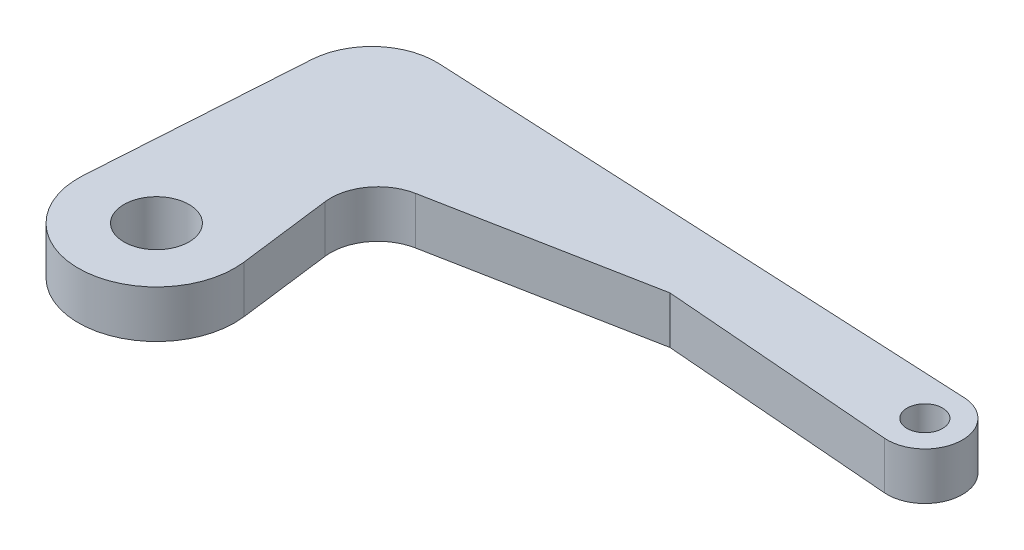
ISO-10303-21;
HEADER;
FILE_DESCRIPTION(('STEP AP214'),'2;1');
FILE_NAME('part.step','',(''),(''),'','','');
FILE_SCHEMA(('AUTOMOTIVE_DESIGN { 1 0 10303 214 1 1 1 1 }'));
ENDSEC;
DATA;
#1=APPLICATION_CONTEXT('core data for automotive mechanical design processes');
#2=APPLICATION_PROTOCOL_DEFINITION('international standard','automotive_design',2000,#1);
#3=PRODUCT_CONTEXT('',#1,'mechanical');
#4=PRODUCT('Part','Part','',(#3));
#5=PRODUCT_RELATED_PRODUCT_CATEGORY('part','',(#4));
#6=PRODUCT_DEFINITION_FORMATION('','',#4);
#7=PRODUCT_DEFINITION_CONTEXT('part definition',#1,'design');
#8=PRODUCT_DEFINITION('design','',#6,#7);
#9=PRODUCT_DEFINITION_SHAPE('','',#8);
#10=(LENGTH_UNIT() NAMED_UNIT(*) SI_UNIT(.MILLI.,.METRE.));
#11=(NAMED_UNIT(*) PLANE_ANGLE_UNIT() SI_UNIT($,.RADIAN.));
#12=(NAMED_UNIT(*) SI_UNIT($,.STERADIAN.) SOLID_ANGLE_UNIT());
#13=UNCERTAINTY_MEASURE_WITH_UNIT(LENGTH_MEASURE(1.E-05),#10,'distance_accuracy_value','');
#14=(GEOMETRIC_REPRESENTATION_CONTEXT(3) GLOBAL_UNCERTAINTY_ASSIGNED_CONTEXT((#13)) GLOBAL_UNIT_ASSIGNED_CONTEXT((#10,
#11,#12)) REPRESENTATION_CONTEXT('',''));
#15=CARTESIAN_POINT('',(0.,0.,0.));
#16=DIRECTION('',(0.,0.,1.));
#17=DIRECTION('',(1.,0.,0.));
#18=AXIS2_PLACEMENT_3D('',#15,#16,#17);
#19=CARTESIAN_POINT('',(9.52234420175606,4.,-9.20862610009547));
#20=DIRECTION('',(0.,-1.,0.));
#21=DIRECTION('',(0.,0.,-1.));
#22=AXIS2_PLACEMENT_3D('',#19,#20,#21);
#23=PLANE('',#22);
#24=CARTESIAN_POINT('',(9.52234420175606,4.,-9.20862610009547));
#25=DIRECTION('',(0.,-1.,0.));
#26=DIRECTION('',(0.,0.,-1.));
#27=AXIS2_PLACEMENT_3D('',#24,#25,#26);
#28=CIRCLE('',#27,4.);
#29=CARTESIAN_POINT('',(5.55416512734207,4.,-8.70508381449976));
#30=VERTEX_POINT('',#29);
#31=CARTESIAN_POINT('',(8.76679218391496,4.,-13.1366206454502));
#32=VERTEX_POINT('',#31);
#33=EDGE_CURVE('E155',#30,#32,#28,.T.);
#34=ORIENTED_EDGE('',*,*,#33,.T.);
#35=DIRECTION('',(0.981998636338674,0.,-0.188888004460274));
#36=VECTOR('',#35,1.);
#37=CARTESIAN_POINT('',(26.8096543901335,4.,-16.6071756042545));
#38=LINE('',#37,#36);
#39=CARTESIAN_POINT('',(26.8096543901335,4.,-16.6071756042545));
#40=VERTEX_POINT('',#39);
#41=EDGE_CURVE('E98',#32,#40,#38,.T.);
#42=ORIENTED_EDGE('',*,*,#41,.T.);
#43=DIRECTION('',(0.99683244169773,0.,0.0795303915427397));
#44=VECTOR('',#43,1.);
#45=CARTESIAN_POINT('',(46.5214753194434,4.,-15.0345052426656));
#46=LINE('',#45,#44);
#47=CARTESIAN_POINT('',(46.5214753194434,4.,-15.0345052426656));
#48=VERTEX_POINT('',#47);
#49=EDGE_CURVE('E173',#40,#48,#46,.T.);
#50=ORIENTED_EDGE('',*,*,#49,.T.);
#51=CARTESIAN_POINT('',(46.7742611361364,4.,-18.2029179461947));
#52=DIRECTION('',(0.,1.,0.));
#53=DIRECTION('',(0.,0.,1.));
#54=AXIS2_PLACEMENT_3D('',#51,#52,#53);
#55=CIRCLE('',#54,3.17848072654309);
#56=CARTESIAN_POINT('',(46.927651624735,4.,-21.377695274924));
#57=VERTEX_POINT('',#56);
#58=EDGE_CURVE('E190',#48,#57,#55,.T.);
#59=ORIENTED_EDGE('',*,*,#58,.T.);
#60=DIRECTION('',(-0.998834852833025,0.,-0.0482590589012009));
#61=VECTOR('',#60,1.);
#62=CARTESIAN_POINT('',(46.927651624735,4.,-21.377695274924));
#63=LINE('',#62,#61);
#64=CARTESIAN_POINT('',(0.262324785062392,4.,-23.6323470326315));
#65=VERTEX_POINT('',#64);
#66=EDGE_CURVE('E189',#57,#65,#63,.T.);
#67=ORIENTED_EDGE('',*,*,#66,.T.);
#68=CARTESIAN_POINT('',(0.,4.,-18.2029179461947));
#69=DIRECTION('',(0.,1.,0.));
#70=DIRECTION('',(0.,0.,1.));
#71=AXIS2_PLACEMENT_3D('',#68,#69,#70);
#72=CIRCLE('',#71,5.43576254977205);
#73=CARTESIAN_POINT('',(-5.42452126957882,4.,-18.552322430126));
#74=VERTEX_POINT('',#73);
#75=EDGE_CURVE('E120',#65,#74,#72,.T.);
#76=ORIENTED_EDGE('',*,*,#75,.T.);
#77=DIRECTION('',(-0.0642788349807451,0.,0.997931977327873));
#78=VECTOR('',#77,1.);
#79=CARTESIAN_POINT('',(-5.42452126957882,4.,-18.552322430126));
#80=LINE('',#79,#78);
#81=CARTESIAN_POINT('',(-6.59216391292445,4.,-0.424614729211823));
#82=VERTEX_POINT('',#81);
#83=EDGE_CURVE('E114',#74,#82,#80,.T.);
#84=ORIENTED_EDGE('',*,*,#83,.T.);
#85=CARTESIAN_POINT('',(0.,4.,0.));
#86=DIRECTION('',(0.,1.,0.));
#87=DIRECTION('',(0.,0.,1.));
#88=AXIS2_PLACEMENT_3D('',#85,#86,#87);
#89=CIRCLE('',#88,6.60582490860354);
#90=CARTESIAN_POINT('',(6.55327404289082,4.,-0.831578043180825));
#91=VERTEX_POINT('',#90);
#92=EDGE_CURVE('E118',#82,#91,#89,.T.);
#93=ORIENTED_EDGE('',*,*,#92,.T.);
#94=DIRECTION('',(-0.125885571398928,0.,-0.992044768603497));
#95=VECTOR('',#94,1.);
#96=CARTESIAN_POINT('',(5.55416512734207,4.,-8.70508381449976));
#97=LINE('',#96,#95);
#98=EDGE_CURVE('E52',#91,#30,#97,.T.);
#99=ORIENTED_EDGE('',*,*,#98,.T.);
#100=EDGE_LOOP('',(#34,#42,#50,#59,#67,#76,#84,#93,#99));
#101=FACE_BOUND('',#100,.T.);
#102=CARTESIAN_POINT('',(0.,4.,0.));
#103=DIRECTION('',(0.,1.,0.));
#104=DIRECTION('',(0.,0.,1.));
#105=AXIS2_PLACEMENT_3D('',#102,#103,#104);
#106=CIRCLE('',#105,2.75);
#107=CARTESIAN_POINT('',(0.,4.,2.75));
#108=VERTEX_POINT('',#107);
#109=EDGE_CURVE('E142',#108,#108,#106,.T.);
#110=ORIENTED_EDGE('',*,*,#109,.F.);
#111=EDGE_LOOP('',(#110));
#112=FACE_BOUND('',#111,.T.);
#113=CARTESIAN_POINT('',(46.7742611361364,4.,-18.2029179461947));
#114=DIRECTION('',(0.,1.,0.));
#115=DIRECTION('',(0.,0.,1.));
#116=AXIS2_PLACEMENT_3D('',#113,#114,#115);
#117=CIRCLE('',#116,1.5);
#118=CARTESIAN_POINT('',(46.7742611361364,4.,-16.7029179461947));
#119=VERTEX_POINT('',#118);
#120=EDGE_CURVE('E200',#119,#119,#117,.T.);
#121=ORIENTED_EDGE('',*,*,#120,.F.);
#122=EDGE_LOOP('',(#121));
#123=FACE_BOUND('',#122,.T.);
#124=ADVANCED_FACE('F35',(#101,#112,#123),#23,.F.);
#125=CARTESIAN_POINT('',(9.52234420175606,0.,-9.20862610009547));
#126=DIRECTION('',(0.,-1.,0.));
#127=DIRECTION('',(0.,0.,-1.));
#128=AXIS2_PLACEMENT_3D('',#125,#126,#127);
#129=PLANE('',#128);
#130=CARTESIAN_POINT('',(0.,0.,0.));
#131=DIRECTION('',(0.,1.,0.));
#132=DIRECTION('',(0.,0.,1.));
#133=AXIS2_PLACEMENT_3D('',#130,#131,#132);
#134=CIRCLE('',#133,2.75);
#135=CARTESIAN_POINT('',(0.,0.,2.75));
#136=VERTEX_POINT('',#135);
#137=EDGE_CURVE('E197',#136,#136,#134,.T.);
#138=ORIENTED_EDGE('',*,*,#137,.T.);
#139=EDGE_LOOP('',(#138));
#140=FACE_BOUND('',#139,.T.);
#141=CARTESIAN_POINT('',(9.52234420175606,0.,-9.20862610009547));
#142=DIRECTION('',(0.,-1.,0.));
#143=DIRECTION('',(0.,0.,-1.));
#144=AXIS2_PLACEMENT_3D('',#141,#142,#143);
#145=CIRCLE('',#144,4.);
#146=CARTESIAN_POINT('',(5.55416512734207,0.,-8.70508381449976));
#147=VERTEX_POINT('',#146);
#148=CARTESIAN_POINT('',(8.76679218391496,0.,-13.1366206454502));
#149=VERTEX_POINT('',#148);
#150=EDGE_CURVE('E138',#147,#149,#145,.T.);
#151=ORIENTED_EDGE('',*,*,#150,.F.);
#152=DIRECTION('',(-0.125885571398928,0.,-0.992044768603497));
#153=VECTOR('',#152,1.);
#154=CARTESIAN_POINT('',(5.55416512734207,0.,-8.70508381449976));
#155=LINE('',#154,#153);
#156=CARTESIAN_POINT('',(6.55327404289082,0.,-0.831578043180825));
#157=VERTEX_POINT('',#156);
#158=EDGE_CURVE('E90',#157,#147,#155,.T.);
#159=ORIENTED_EDGE('',*,*,#158,.F.);
#160=CARTESIAN_POINT('',(0.,0.,0.));
#161=DIRECTION('',(0.,1.,0.));
#162=DIRECTION('',(0.,0.,1.));
#163=AXIS2_PLACEMENT_3D('',#160,#161,#162);
#164=CIRCLE('',#163,6.60582490860354);
#165=CARTESIAN_POINT('',(-6.59216391292445,0.,-0.424614729211823));
#166=VERTEX_POINT('',#165);
#167=EDGE_CURVE('E84',#166,#157,#164,.T.);
#168=ORIENTED_EDGE('',*,*,#167,.F.);
#169=DIRECTION('',(-0.0642788349807451,0.,0.997931977327873));
#170=VECTOR('',#169,1.);
#171=CARTESIAN_POINT('',(-5.42452126957882,0.,-18.552322430126));
#172=LINE('',#171,#170);
#173=CARTESIAN_POINT('',(-5.42452126957882,0.,-18.552322430126));
#174=VERTEX_POINT('',#173);
#175=EDGE_CURVE('E128',#174,#166,#172,.T.);
#176=ORIENTED_EDGE('',*,*,#175,.F.);
#177=CARTESIAN_POINT('',(0.,0.,-18.2029179461947));
#178=DIRECTION('',(0.,1.,0.));
#179=DIRECTION('',(0.,0.,1.));
#180=AXIS2_PLACEMENT_3D('',#177,#178,#179);
#181=CIRCLE('',#180,5.43576254977205);
#182=CARTESIAN_POINT('',(0.262324785062392,0.,-23.6323470326315));
#183=VERTEX_POINT('',#182);
#184=EDGE_CURVE('E150',#183,#174,#181,.T.);
#185=ORIENTED_EDGE('',*,*,#184,.F.);
#186=DIRECTION('',(-0.998834852833025,0.,-0.0482590589012009));
#187=VECTOR('',#186,1.);
#188=CARTESIAN_POINT('',(46.927651624735,0.,-21.377695274924));
#189=LINE('',#188,#187);
#190=CARTESIAN_POINT('',(46.927651624735,0.,-21.377695274924));
#191=VERTEX_POINT('',#190);
#192=EDGE_CURVE('E148',#191,#183,#189,.T.);
#193=ORIENTED_EDGE('',*,*,#192,.F.);
#194=CARTESIAN_POINT('',(46.7742611361364,0.,-18.2029179461947));
#195=DIRECTION('',(0.,1.,0.));
#196=DIRECTION('',(0.,0.,1.));
#197=AXIS2_PLACEMENT_3D('',#194,#195,#196);
#198=CIRCLE('',#197,3.17848072654309);
#199=CARTESIAN_POINT('',(46.5214753194434,0.,-15.0345052426656));
#200=VERTEX_POINT('',#199);
#201=EDGE_CURVE('E146',#200,#191,#198,.T.);
#202=ORIENTED_EDGE('',*,*,#201,.F.);
#203=DIRECTION('',(0.99683244169773,0.,0.0795303915427397));
#204=VECTOR('',#203,1.);
#205=CARTESIAN_POINT('',(46.5214753194434,0.,-15.0345052426656));
#206=LINE('',#205,#204);
#207=CARTESIAN_POINT('',(26.8096543901335,0.,-16.6071756042545));
#208=VERTEX_POINT('',#207);
#209=EDGE_CURVE('E144',#208,#200,#206,.T.);
#210=ORIENTED_EDGE('',*,*,#209,.F.);
#211=DIRECTION('',(0.981998636338674,0.,-0.188888004460274));
#212=VECTOR('',#211,1.);
#213=CARTESIAN_POINT('',(26.8096543901335,0.,-16.6071756042545));
#214=LINE('',#213,#212);
#215=EDGE_CURVE('E141',#149,#208,#214,.T.);
#216=ORIENTED_EDGE('',*,*,#215,.F.);
#217=EDGE_LOOP('',(#151,#159,#168,#176,#185,#193,#202,#210,#216));
#218=FACE_BOUND('',#217,.T.);
#219=CARTESIAN_POINT('',(46.7742611361364,0.,-18.2029179461947));
#220=DIRECTION('',(0.,1.,0.));
#221=DIRECTION('',(0.,0.,1.));
#222=AXIS2_PLACEMENT_3D('',#219,#220,#221);
#223=CIRCLE('',#222,1.5);
#224=CARTESIAN_POINT('',(46.7742611361364,0.,-16.7029179461947));
#225=VERTEX_POINT('',#224);
#226=EDGE_CURVE('E203',#225,#225,#223,.T.);
#227=ORIENTED_EDGE('',*,*,#226,.T.);
#228=EDGE_LOOP('',(#227));
#229=FACE_BOUND('',#228,.T.);
#230=ADVANCED_FACE('F177',(#140,#218,#229),#129,.T.);
#231=CARTESIAN_POINT('',(9.52234420175606,4.,-9.20862610009547));
#232=DIRECTION('',(0.,-1.,0.));
#233=DIRECTION('',(0.,0.,-1.));
#234=AXIS2_PLACEMENT_3D('',#231,#232,#233);
#235=CYLINDRICAL_SURFACE('',#234,4.);
#236=ORIENTED_EDGE('',*,*,#150,.T.);
#237=DIRECTION('',(0.,-1.,0.));
#238=VECTOR('',#237,1.);
#239=CARTESIAN_POINT('',(8.76679218391496,4.,-13.1366206454502));
#240=LINE('',#239,#238);
#241=EDGE_CURVE('E11',#32,#149,#240,.T.);
#242=ORIENTED_EDGE('',*,*,#241,.F.);
#243=ORIENTED_EDGE('',*,*,#33,.F.);
#244=DIRECTION('',(0.,-1.,0.));
#245=VECTOR('',#244,1.);
#246=CARTESIAN_POINT('',(5.55416512734207,4.,-8.70508381449976));
#247=LINE('',#246,#245);
#248=EDGE_CURVE('E134',#30,#147,#247,.T.);
#249=ORIENTED_EDGE('',*,*,#248,.T.);
#250=EDGE_LOOP('',(#236,#242,#243,#249));
#251=FACE_BOUND('',#250,.T.);
#252=ADVANCED_FACE('F37',(#251),#235,.F.);
#253=CARTESIAN_POINT('',(26.8096543901335,4.,-16.6071756042545));
#254=DIRECTION('',(-0.188888004460274,0.,-0.981998636338674));
#255=DIRECTION('',(-0.981998636338674,0.,0.188888004460274));
#256=AXIS2_PLACEMENT_3D('',#253,#254,#255);
#257=PLANE('',#256);
#258=ORIENTED_EDGE('',*,*,#215,.T.);
#259=DIRECTION('',(0.,-1.,0.));
#260=VECTOR('',#259,1.);
#261=CARTESIAN_POINT('',(26.8096543901335,4.,-16.6071756042545));
#262=LINE('',#261,#260);
#263=EDGE_CURVE('E44',#40,#208,#262,.T.);
#264=ORIENTED_EDGE('',*,*,#263,.F.);
#265=ORIENTED_EDGE('',*,*,#41,.F.);
#266=ORIENTED_EDGE('',*,*,#241,.T.);
#267=EDGE_LOOP('',(#258,#264,#265,#266));
#268=FACE_BOUND('',#267,.T.);
#269=ADVANCED_FACE('F239',(#268),#257,.F.);
#270=CARTESIAN_POINT('',(46.5214753194434,4.,-15.0345052426656));
#271=DIRECTION('',(0.0795303915427397,0.,-0.99683244169773));
#272=DIRECTION('',(-0.99683244169773,0.,-0.0795303915427397));
#273=AXIS2_PLACEMENT_3D('',#270,#271,#272);
#274=PLANE('',#273);
#275=ORIENTED_EDGE('',*,*,#209,.T.);
#276=DIRECTION('',(0.,-1.,0.));
#277=VECTOR('',#276,1.);
#278=CARTESIAN_POINT('',(46.5214753194434,4.,-15.0345052426656));
#279=LINE('',#278,#277);
#280=EDGE_CURVE('E165',#48,#200,#279,.T.);
#281=ORIENTED_EDGE('',*,*,#280,.F.);
#282=ORIENTED_EDGE('',*,*,#49,.F.);
#283=ORIENTED_EDGE('',*,*,#263,.T.);
#284=EDGE_LOOP('',(#275,#281,#282,#283));
#285=FACE_BOUND('',#284,.T.);
#286=ADVANCED_FACE('F171',(#285),#274,.F.);
#287=CARTESIAN_POINT('',(46.7742611361364,4.,-18.2029179461947));
#288=DIRECTION('',(0.,-1.,0.));
#289=DIRECTION('',(0.,0.,-1.));
#290=AXIS2_PLACEMENT_3D('',#287,#288,#289);
#291=CYLINDRICAL_SURFACE('',#290,3.17848072654309);
#292=ORIENTED_EDGE('',*,*,#201,.T.);
#293=DIRECTION('',(0.,-1.,0.));
#294=VECTOR('',#293,1.);
#295=CARTESIAN_POINT('',(46.927651624735,4.,-21.377695274924));
#296=LINE('',#295,#294);
#297=EDGE_CURVE('E162',#57,#191,#296,.T.);
#298=ORIENTED_EDGE('',*,*,#297,.F.);
#299=ORIENTED_EDGE('',*,*,#58,.F.);
#300=ORIENTED_EDGE('',*,*,#280,.T.);
#301=EDGE_LOOP('',(#292,#298,#299,#300));
#302=FACE_BOUND('',#301,.T.);
#303=ADVANCED_FACE('F183',(#302),#291,.T.);
#304=CARTESIAN_POINT('',(46.927651624735,4.,-21.377695274924));
#305=DIRECTION('',(-0.0482590589012009,0.,0.998834852833025));
#306=DIRECTION('',(0.998834852833025,0.,0.048259058901201));
#307=AXIS2_PLACEMENT_3D('',#304,#305,#306);
#308=PLANE('',#307);
#309=ORIENTED_EDGE('',*,*,#192,.T.);
#310=DIRECTION('',(0.,-1.,0.));
#311=VECTOR('',#310,1.);
#312=CARTESIAN_POINT('',(0.262324785062392,4.,-23.6323470326315));
#313=LINE('',#312,#311);
#314=EDGE_CURVE('E159',#65,#183,#313,.T.);
#315=ORIENTED_EDGE('',*,*,#314,.F.);
#316=ORIENTED_EDGE('',*,*,#66,.F.);
#317=ORIENTED_EDGE('',*,*,#297,.T.);
#318=EDGE_LOOP('',(#309,#315,#316,#317));
#319=FACE_BOUND('',#318,.T.);
#320=ADVANCED_FACE('F187',(#319),#308,.F.);
#321=CARTESIAN_POINT('',(0.,4.,-18.2029179461947));
#322=DIRECTION('',(0.,-1.,0.));
#323=DIRECTION('',(0.,0.,-1.));
#324=AXIS2_PLACEMENT_3D('',#321,#322,#323);
#325=CYLINDRICAL_SURFACE('',#324,5.43576254977205);
#326=ORIENTED_EDGE('',*,*,#184,.T.);
#327=DIRECTION('',(0.,-1.,0.));
#328=VECTOR('',#327,1.);
#329=CARTESIAN_POINT('',(-5.42452126957882,4.,-18.552322430126));
#330=LINE('',#329,#328);
#331=EDGE_CURVE('E129',#74,#174,#330,.T.);
#332=ORIENTED_EDGE('',*,*,#331,.F.);
#333=ORIENTED_EDGE('',*,*,#75,.F.);
#334=ORIENTED_EDGE('',*,*,#314,.T.);
#335=EDGE_LOOP('',(#326,#332,#333,#334));
#336=FACE_BOUND('',#335,.T.);
#337=ADVANCED_FACE('F230',(#336),#325,.T.);
#338=CARTESIAN_POINT('',(-5.42452126957882,4.,-18.552322430126));
#339=DIRECTION('',(0.997931977327873,0.,0.0642788349807451));
#340=DIRECTION('',(0.0642788349807451,0.,-0.997931977327873));
#341=AXIS2_PLACEMENT_3D('',#338,#339,#340);
#342=PLANE('',#341);
#343=ORIENTED_EDGE('',*,*,#175,.T.);
#344=DIRECTION('',(0.,-1.,0.));
#345=VECTOR('',#344,1.);
#346=CARTESIAN_POINT('',(-6.59216391292445,4.,-0.424614729211823));
#347=LINE('',#346,#345);
#348=EDGE_CURVE('E125',#82,#166,#347,.T.);
#349=ORIENTED_EDGE('',*,*,#348,.F.);
#350=ORIENTED_EDGE('',*,*,#83,.F.);
#351=ORIENTED_EDGE('',*,*,#331,.T.);
#352=EDGE_LOOP('',(#343,#349,#350,#351));
#353=FACE_BOUND('',#352,.T.);
#354=ADVANCED_FACE('F126',(#353),#342,.F.);
#355=CARTESIAN_POINT('',(0.,4.,0.));
#356=DIRECTION('',(0.,-1.,0.));
#357=DIRECTION('',(0.,0.,-1.));
#358=AXIS2_PLACEMENT_3D('',#355,#356,#357);
#359=CYLINDRICAL_SURFACE('',#358,6.60582490860354);
#360=ORIENTED_EDGE('',*,*,#167,.T.);
#361=DIRECTION('',(0.,-1.,0.));
#362=VECTOR('',#361,1.);
#363=CARTESIAN_POINT('',(6.55327404289082,4.,-0.831578043180825));
#364=LINE('',#363,#362);
#365=EDGE_CURVE('E130',#91,#157,#364,.T.);
#366=ORIENTED_EDGE('',*,*,#365,.F.);
#367=ORIENTED_EDGE('',*,*,#92,.F.);
#368=ORIENTED_EDGE('',*,*,#348,.T.);
#369=EDGE_LOOP('',(#360,#366,#367,#368));
#370=FACE_BOUND('',#369,.T.);
#371=ADVANCED_FACE('F132',(#370),#359,.T.);
#372=CARTESIAN_POINT('',(5.55416512734207,4.,-8.70508381449976));
#373=DIRECTION('',(-0.992044768603497,0.,0.125885571398928));
#374=DIRECTION('',(0.125885571398928,0.,0.992044768603497));
#375=AXIS2_PLACEMENT_3D('',#372,#373,#374);
#376=PLANE('',#375);
#377=ORIENTED_EDGE('',*,*,#158,.T.);
#378=ORIENTED_EDGE('',*,*,#248,.F.);
#379=ORIENTED_EDGE('',*,*,#98,.F.);
#380=ORIENTED_EDGE('',*,*,#365,.T.);
#381=EDGE_LOOP('',(#377,#378,#379,#380));
#382=FACE_BOUND('',#381,.T.);
#383=ADVANCED_FACE('F223',(#382),#376,.F.);
#384=CARTESIAN_POINT('',(0.,4.,0.));
#385=DIRECTION('',(0.,-1.,0.));
#386=DIRECTION('',(0.,0.,-1.));
#387=AXIS2_PLACEMENT_3D('',#384,#385,#386);
#388=CYLINDRICAL_SURFACE('',#387,2.75);
#389=ORIENTED_EDGE('',*,*,#109,.T.);
#390=EDGE_LOOP('',(#389));
#391=FACE_BOUND('',#390,.T.);
#392=ORIENTED_EDGE('',*,*,#137,.F.);
#393=EDGE_LOOP('',(#392));
#394=FACE_BOUND('',#393,.T.);
#395=ADVANCED_FACE('F220',(#391,#394),#388,.F.);
#396=CARTESIAN_POINT('',(46.7742611361364,4.,-18.2029179461947));
#397=DIRECTION('',(0.,-1.,0.));
#398=DIRECTION('',(0.,0.,-1.));
#399=AXIS2_PLACEMENT_3D('',#396,#397,#398);
#400=CYLINDRICAL_SURFACE('',#399,1.5);
#401=ORIENTED_EDGE('',*,*,#120,.T.);
#402=EDGE_LOOP('',(#401));
#403=FACE_BOUND('',#402,.T.);
#404=ORIENTED_EDGE('',*,*,#226,.F.);
#405=EDGE_LOOP('',(#404));
#406=FACE_BOUND('',#405,.T.);
#407=ADVANCED_FACE('F209',(#403,#406),#400,.F.);
#408=CLOSED_SHELL('',(#124,#230,#252,#269,#286,#303,#320,#337,#354,#371,#383,#395,#407));
#409=MANIFOLD_SOLID_BREP('B2',#408);
#410=ADVANCED_BREP_SHAPE_REPRESENTATION('',(#18,#409),#14);
#411=SHAPE_DEFINITION_REPRESENTATION(#9,#410);
ENDSEC;
END-ISO-10303-21;
